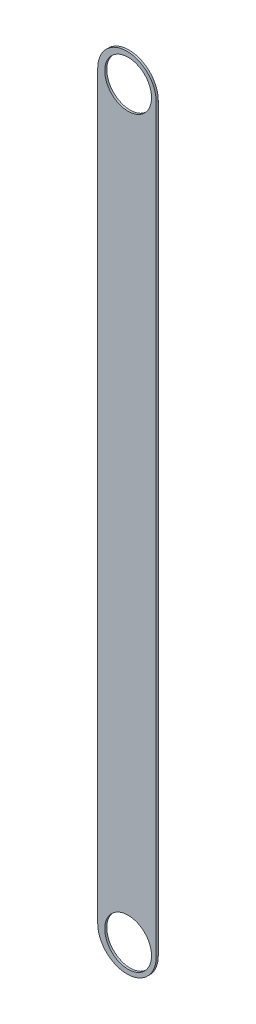
ISO-10303-21;
HEADER;
FILE_DESCRIPTION(('STEP AP214'),'2;1');
FILE_NAME('part.step','',(''),(''),'','','');
FILE_SCHEMA(('AUTOMOTIVE_DESIGN { 1 0 10303 214 1 1 1 1 }'));
ENDSEC;
DATA;
#1=APPLICATION_CONTEXT('core data for automotive mechanical design processes');
#2=APPLICATION_PROTOCOL_DEFINITION('international standard','automotive_design',2000,#1);
#3=PRODUCT_CONTEXT('',#1,'mechanical');
#4=PRODUCT('Part','Part','',(#3));
#5=PRODUCT_RELATED_PRODUCT_CATEGORY('part','',(#4));
#6=PRODUCT_DEFINITION_FORMATION('','',#4);
#7=PRODUCT_DEFINITION_CONTEXT('part definition',#1,'design');
#8=PRODUCT_DEFINITION('design','',#6,#7);
#9=PRODUCT_DEFINITION_SHAPE('','',#8);
#10=(LENGTH_UNIT() NAMED_UNIT(*) SI_UNIT(.MILLI.,.METRE.));
#11=(NAMED_UNIT(*) PLANE_ANGLE_UNIT() SI_UNIT($,.RADIAN.));
#12=(NAMED_UNIT(*) SI_UNIT($,.STERADIAN.) SOLID_ANGLE_UNIT());
#13=UNCERTAINTY_MEASURE_WITH_UNIT(LENGTH_MEASURE(1.E-05),#10,'distance_accuracy_value','');
#14=(GEOMETRIC_REPRESENTATION_CONTEXT(3) GLOBAL_UNCERTAINTY_ASSIGNED_CONTEXT((#13)) GLOBAL_UNIT_ASSIGNED_CONTEXT((#10,
#11,#12)) REPRESENTATION_CONTEXT('',''));
#15=CARTESIAN_POINT('',(0.,0.,0.));
#16=DIRECTION('',(0.,0.,1.));
#17=DIRECTION('',(1.,0.,0.));
#18=AXIS2_PLACEMENT_3D('',#15,#16,#17);
#19=CARTESIAN_POINT('',(57.8999985,62.6200297,0.));
#20=DIRECTION('',(-1.,0.,0.));
#21=DIRECTION('',(0.,1.,0.));
#22=AXIS2_PLACEMENT_3D('',#19,#20,#21);
#23=PLANE('',#22);
#24=DIRECTION('',(0.,1.,0.));
#25=VECTOR('',#24,1.);
#26=CARTESIAN_POINT('',(57.8999985,62.6200297,0.03556));
#27=LINE('',#26,#25);
#28=CARTESIAN_POINT('',(57.8999985,62.6200297,0.03556));
#29=VERTEX_POINT('',#28);
#30=CARTESIAN_POINT('',(57.8999985,75.2800247,0.03556));
#31=VERTEX_POINT('',#30);
#32=EDGE_CURVE('E11',#29,#31,#27,.T.);
#33=ORIENTED_EDGE('',*,*,#32,.F.);
#34=DIRECTION('',(0.,0.,1.));
#35=VECTOR('',#34,1.);
#36=CARTESIAN_POINT('',(57.8999985,62.6200297,0.));
#37=LINE('',#36,#35);
#38=CARTESIAN_POINT('',(57.8999985,62.6200297,0.));
#39=VERTEX_POINT('',#38);
#40=EDGE_CURVE('E24',#39,#29,#37,.T.);
#41=ORIENTED_EDGE('',*,*,#40,.F.);
#42=DIRECTION('',(0.,1.,0.));
#43=VECTOR('',#42,1.);
#44=CARTESIAN_POINT('',(57.8999985,62.6200297,0.));
#45=LINE('',#44,#43);
#46=CARTESIAN_POINT('',(57.8999985,75.2800247,0.));
#47=VERTEX_POINT('',#46);
#48=EDGE_CURVE('E110',#39,#47,#45,.T.);
#49=ORIENTED_EDGE('',*,*,#48,.T.);
#50=DIRECTION('',(0.,0.,1.));
#51=VECTOR('',#50,1.);
#52=CARTESIAN_POINT('',(57.8999985,75.2800247,0.));
#53=LINE('',#52,#51);
#54=EDGE_CURVE('E37',#47,#31,#53,.T.);
#55=ORIENTED_EDGE('',*,*,#54,.T.);
#56=EDGE_LOOP('',(#33,#41,#49,#55));
#57=FACE_BOUND('',#56,.T.);
#58=ADVANCED_FACE('F17',(#57),#23,.F.);
#59=CARTESIAN_POINT('',(57.3999995,62.6200297,0.));
#60=DIRECTION('',(0.,0.,-1.));
#61=DIRECTION('',(-1.,0.,0.));
#62=AXIS2_PLACEMENT_3D('',#59,#60,#61);
#63=CYLINDRICAL_SURFACE('',#62,0.499998999999998);
#64=CARTESIAN_POINT('',(57.3999995,62.6200297,0.03556));
#65=DIRECTION('',(0.,0.,1.));
#66=DIRECTION('',(-1.,0.,0.));
#67=AXIS2_PLACEMENT_3D('',#64,#65,#66);
#68=CIRCLE('',#67,0.499998999999998);
#69=CARTESIAN_POINT('',(56.9000005,62.6200297,0.03556));
#70=VERTEX_POINT('',#69);
#71=EDGE_CURVE('E106',#70,#29,#68,.T.);
#72=ORIENTED_EDGE('',*,*,#71,.F.);
#73=DIRECTION('',(0.,0.,1.));
#74=VECTOR('',#73,1.);
#75=CARTESIAN_POINT('',(56.9000005,62.6200297,0.));
#76=LINE('',#75,#74);
#77=CARTESIAN_POINT('',(56.9000005,62.6200297,0.));
#78=VERTEX_POINT('',#77);
#79=EDGE_CURVE('E104',#78,#70,#76,.T.);
#80=ORIENTED_EDGE('',*,*,#79,.F.);
#81=CARTESIAN_POINT('',(57.3999995,62.6200297,0.));
#82=DIRECTION('',(0.,0.,1.));
#83=DIRECTION('',(-1.,0.,0.));
#84=AXIS2_PLACEMENT_3D('',#81,#82,#83);
#85=CIRCLE('',#84,0.499998999999998);
#86=EDGE_CURVE('E102',#78,#39,#85,.T.);
#87=ORIENTED_EDGE('',*,*,#86,.T.);
#88=ORIENTED_EDGE('',*,*,#40,.T.);
#89=EDGE_LOOP('',(#72,#80,#87,#88));
#90=FACE_BOUND('',#89,.T.);
#91=ADVANCED_FACE('F126',(#90),#63,.T.);
#92=CARTESIAN_POINT('',(57.3999995,75.2800247,0.));
#93=DIRECTION('',(0.,0.,-1.));
#94=DIRECTION('',(1.,0.,0.));
#95=AXIS2_PLACEMENT_3D('',#92,#93,#94);
#96=CYLINDRICAL_SURFACE('',#95,0.499999);
#97=CARTESIAN_POINT('',(57.3999995,75.2800247,0.03556));
#98=DIRECTION('',(0.,0.,1.));
#99=DIRECTION('',(1.,0.,0.));
#100=AXIS2_PLACEMENT_3D('',#97,#98,#99);
#101=CIRCLE('',#100,0.499999);
#102=CARTESIAN_POINT('',(56.9000005,75.2800247,0.03556));
#103=VERTEX_POINT('',#102);
#104=EDGE_CURVE('E99',#31,#103,#101,.T.);
#105=ORIENTED_EDGE('',*,*,#104,.F.);
#106=ORIENTED_EDGE('',*,*,#54,.F.);
#107=CARTESIAN_POINT('',(57.3999995,75.2800247,0.));
#108=DIRECTION('',(0.,0.,1.));
#109=DIRECTION('',(1.,0.,0.));
#110=AXIS2_PLACEMENT_3D('',#107,#108,#109);
#111=CIRCLE('',#110,0.499999);
#112=CARTESIAN_POINT('',(56.9000005,75.2800247,0.));
#113=VERTEX_POINT('',#112);
#114=EDGE_CURVE('E96',#47,#113,#111,.T.);
#115=ORIENTED_EDGE('',*,*,#114,.T.);
#116=DIRECTION('',(0.,0.,1.));
#117=VECTOR('',#116,1.);
#118=CARTESIAN_POINT('',(56.9000005,75.2800247,0.));
#119=LINE('',#118,#117);
#120=EDGE_CURVE('E94',#113,#103,#119,.T.);
#121=ORIENTED_EDGE('',*,*,#120,.T.);
#122=EDGE_LOOP('',(#105,#106,#115,#121));
#123=FACE_BOUND('',#122,.T.);
#124=ADVANCED_FACE('F119',(#123),#96,.T.);
#125=CARTESIAN_POINT('',(56.9000005,75.2800247,0.));
#126=DIRECTION('',(1.,0.,0.));
#127=DIRECTION('',(0.,-1.,0.));
#128=AXIS2_PLACEMENT_3D('',#125,#126,#127);
#129=PLANE('',#128);
#130=DIRECTION('',(0.,-1.,0.));
#131=VECTOR('',#130,1.);
#132=CARTESIAN_POINT('',(56.9000005,75.2800247,0.03556));
#133=LINE('',#132,#131);
#134=EDGE_CURVE('E91',#103,#70,#133,.T.);
#135=ORIENTED_EDGE('',*,*,#134,.F.);
#136=ORIENTED_EDGE('',*,*,#120,.F.);
#137=DIRECTION('',(0.,-1.,0.));
#138=VECTOR('',#137,1.);
#139=CARTESIAN_POINT('',(56.9000005,75.2800247,0.));
#140=LINE('',#139,#138);
#141=EDGE_CURVE('E88',#113,#78,#140,.T.);
#142=ORIENTED_EDGE('',*,*,#141,.T.);
#143=ORIENTED_EDGE('',*,*,#79,.T.);
#144=EDGE_LOOP('',(#135,#136,#142,#143));
#145=FACE_BOUND('',#144,.T.);
#146=ADVANCED_FACE('F125',(#145),#129,.F.);
#147=CARTESIAN_POINT('',(57.420002,75.3000272,0.));
#148=DIRECTION('',(0.,0.,-1.));
#149=DIRECTION('',(1.,0.,0.));
#150=AXIS2_PLACEMENT_3D('',#147,#148,#149);
#151=CYLINDRICAL_SURFACE('',#150,0.3999992);
#152=DIRECTION('',(0.,0.,1.));
#153=VECTOR('',#152,1.);
#154=CARTESIAN_POINT('',(57.8200012,75.3000272,0.));
#155=LINE('',#154,#153);
#156=CARTESIAN_POINT('',(57.8200012,75.3000272,0.));
#157=VERTEX_POINT('',#156);
#158=CARTESIAN_POINT('',(57.8200012,75.3000272,0.03556));
#159=VERTEX_POINT('',#158);
#160=EDGE_CURVE('E86',#157,#159,#155,.T.);
#161=ORIENTED_EDGE('',*,*,#160,.T.);
#162=CARTESIAN_POINT('',(57.420002,75.3000272,0.03556));
#163=DIRECTION('',(0.,0.,1.));
#164=DIRECTION('',(1.,0.,0.));
#165=AXIS2_PLACEMENT_3D('',#162,#163,#164);
#166=CIRCLE('',#165,0.3999992);
#167=EDGE_CURVE('E83',#159,#159,#166,.T.);
#168=ORIENTED_EDGE('',*,*,#167,.T.);
#169=ORIENTED_EDGE('',*,*,#160,.F.);
#170=CARTESIAN_POINT('',(57.420002,75.3000272,0.));
#171=DIRECTION('',(0.,0.,1.));
#172=DIRECTION('',(1.,0.,0.));
#173=AXIS2_PLACEMENT_3D('',#170,#171,#172);
#174=CIRCLE('',#173,0.3999992);
#175=EDGE_CURVE('E74',#157,#157,#174,.T.);
#176=ORIENTED_EDGE('',*,*,#175,.F.);
#177=EDGE_LOOP('',(#161,#168,#169,#176));
#178=FACE_BOUND('',#177,.T.);
#179=ADVANCED_FACE('F137',(#178),#151,.F.);
#180=CARTESIAN_POINT('',(57.420002,62.6000272,0.));
#181=DIRECTION('',(0.,0.,-1.));
#182=DIRECTION('',(1.,0.,0.));
#183=AXIS2_PLACEMENT_3D('',#180,#181,#182);
#184=CYLINDRICAL_SURFACE('',#183,0.3999992);
#185=DIRECTION('',(0.,0.,1.));
#186=VECTOR('',#185,1.);
#187=CARTESIAN_POINT('',(57.8200012,62.6000272,0.));
#188=LINE('',#187,#186);
#189=CARTESIAN_POINT('',(57.8200012,62.6000272,0.));
#190=VERTEX_POINT('',#189);
#191=CARTESIAN_POINT('',(57.8200012,62.6000272,0.03556));
#192=VERTEX_POINT('',#191);
#193=EDGE_CURVE('E68',#190,#192,#188,.T.);
#194=ORIENTED_EDGE('',*,*,#193,.T.);
#195=CARTESIAN_POINT('',(57.420002,62.6000272,0.03556));
#196=DIRECTION('',(0.,0.,1.));
#197=DIRECTION('',(1.,0.,0.));
#198=AXIS2_PLACEMENT_3D('',#195,#196,#197);
#199=CIRCLE('',#198,0.3999992);
#200=EDGE_CURVE('E73',#192,#192,#199,.T.);
#201=ORIENTED_EDGE('',*,*,#200,.T.);
#202=ORIENTED_EDGE('',*,*,#193,.F.);
#203=CARTESIAN_POINT('',(57.420002,62.6000272,0.));
#204=DIRECTION('',(0.,0.,1.));
#205=DIRECTION('',(1.,0.,0.));
#206=AXIS2_PLACEMENT_3D('',#203,#204,#205);
#207=CIRCLE('',#206,0.3999992);
#208=EDGE_CURVE('E71',#190,#190,#207,.T.);
#209=ORIENTED_EDGE('',*,*,#208,.F.);
#210=EDGE_LOOP('',(#194,#201,#202,#209));
#211=FACE_BOUND('',#210,.T.);
#212=ADVANCED_FACE('F70',(#211),#184,.F.);
#213=CARTESIAN_POINT('',(57.8999985,62.6200297,0.));
#214=DIRECTION('',(0.,0.,-1.));
#215=DIRECTION('',(-1.,0.,0.));
#216=AXIS2_PLACEMENT_3D('',#213,#214,#215);
#217=PLANE('',#216);
#218=ORIENTED_EDGE('',*,*,#48,.F.);
#219=ORIENTED_EDGE('',*,*,#86,.F.);
#220=ORIENTED_EDGE('',*,*,#141,.F.);
#221=ORIENTED_EDGE('',*,*,#114,.F.);
#222=EDGE_LOOP('',(#218,#219,#220,#221));
#223=FACE_BOUND('',#222,.T.);
#224=ORIENTED_EDGE('',*,*,#175,.T.);
#225=EDGE_LOOP('',(#224));
#226=FACE_BOUND('',#225,.T.);
#227=ORIENTED_EDGE('',*,*,#208,.T.);
#228=EDGE_LOOP('',(#227));
#229=FACE_BOUND('',#228,.T.);
#230=ADVANCED_FACE('F77',(#223,#226,#229),#217,.T.);
#231=CARTESIAN_POINT('',(57.8999985,62.6200297,0.03556));
#232=DIRECTION('',(0.,0.,-1.));
#233=DIRECTION('',(-1.,0.,0.));
#234=AXIS2_PLACEMENT_3D('',#231,#232,#233);
#235=PLANE('',#234);
#236=ORIENTED_EDGE('',*,*,#134,.T.);
#237=ORIENTED_EDGE('',*,*,#71,.T.);
#238=ORIENTED_EDGE('',*,*,#32,.T.);
#239=ORIENTED_EDGE('',*,*,#104,.T.);
#240=EDGE_LOOP('',(#236,#237,#238,#239));
#241=FACE_BOUND('',#240,.T.);
#242=ORIENTED_EDGE('',*,*,#167,.F.);
#243=EDGE_LOOP('',(#242));
#244=FACE_BOUND('',#243,.T.);
#245=ORIENTED_EDGE('',*,*,#200,.F.);
#246=EDGE_LOOP('',(#245));
#247=FACE_BOUND('',#246,.T.);
#248=ADVANCED_FACE('F122',(#241,#244,#247),#235,.F.);
#249=CLOSED_SHELL('',(#58,#91,#124,#146,#179,#212,#230,#248));
#250=MANIFOLD_SOLID_BREP('B1',#249);
#251=ADVANCED_BREP_SHAPE_REPRESENTATION('',(#18,#250),#14);
#252=SHAPE_DEFINITION_REPRESENTATION(#9,#251);
ENDSEC;
END-ISO-10303-21;
